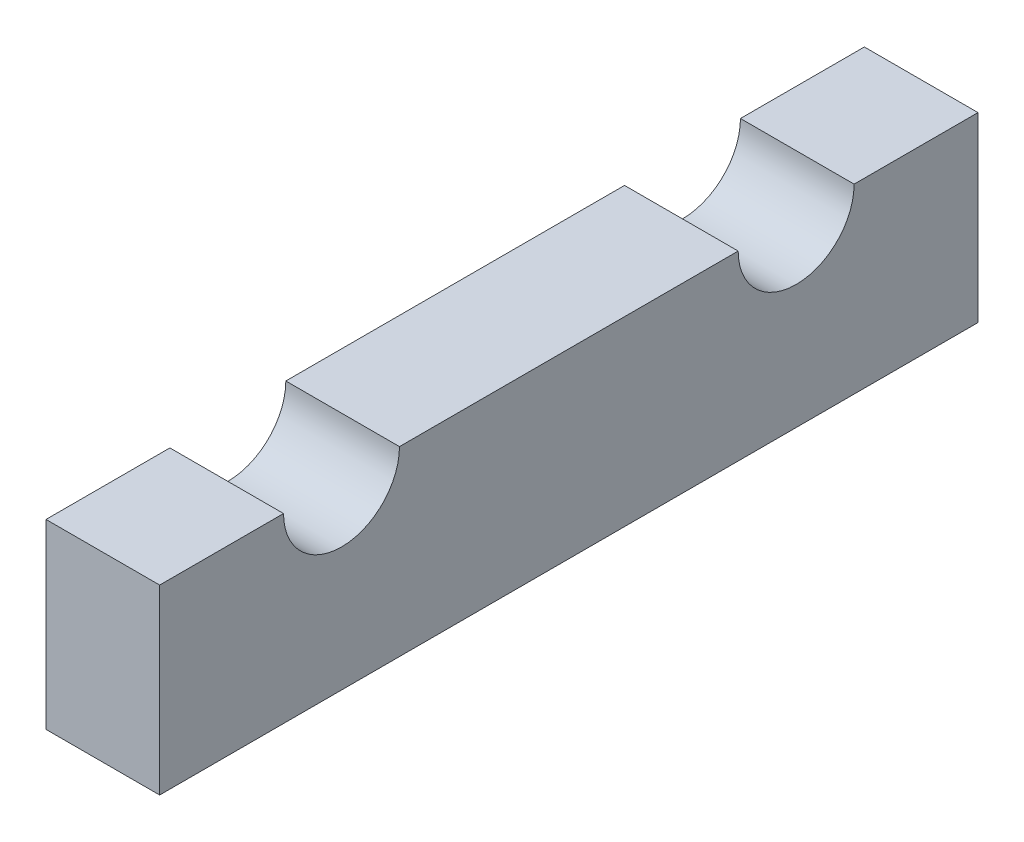
ISO-10303-21;
HEADER;
FILE_DESCRIPTION(('STEP AP214'),'2;1');
FILE_NAME('part.step','',(''),(''),'','','');
FILE_SCHEMA(('AUTOMOTIVE_DESIGN { 1 0 10303 214 1 1 1 1 }'));
ENDSEC;
DATA;
#1=APPLICATION_CONTEXT('core data for automotive mechanical design processes');
#2=APPLICATION_PROTOCOL_DEFINITION('international standard','automotive_design',2000,#1);
#3=PRODUCT_CONTEXT('',#1,'mechanical');
#4=PRODUCT('Part','Part','',(#3));
#5=PRODUCT_RELATED_PRODUCT_CATEGORY('part','',(#4));
#6=PRODUCT_DEFINITION_FORMATION('','',#4);
#7=PRODUCT_DEFINITION_CONTEXT('part definition',#1,'design');
#8=PRODUCT_DEFINITION('design','',#6,#7);
#9=PRODUCT_DEFINITION_SHAPE('','',#8);
#10=(LENGTH_UNIT() NAMED_UNIT(*) SI_UNIT(.MILLI.,.METRE.));
#11=(NAMED_UNIT(*) PLANE_ANGLE_UNIT() SI_UNIT($,.RADIAN.));
#12=(NAMED_UNIT(*) SI_UNIT($,.STERADIAN.) SOLID_ANGLE_UNIT());
#13=UNCERTAINTY_MEASURE_WITH_UNIT(LENGTH_MEASURE(1.E-05),#10,'distance_accuracy_value','');
#14=(GEOMETRIC_REPRESENTATION_CONTEXT(3) GLOBAL_UNCERTAINTY_ASSIGNED_CONTEXT((#13)) GLOBAL_UNIT_ASSIGNED_CONTEXT((#10,
#11,#12)) REPRESENTATION_CONTEXT('',''));
#15=CARTESIAN_POINT('',(0.,0.,0.));
#16=DIRECTION('',(0.,0.,1.));
#17=DIRECTION('',(1.,0.,0.));
#18=AXIS2_PLACEMENT_3D('',#15,#16,#17);
#19=CARTESIAN_POINT('',(5.,0.,18.));
#20=DIRECTION('',(0.,0.,-1.));
#21=DIRECTION('',(-1.,0.,0.));
#22=AXIS2_PLACEMENT_3D('',#19,#20,#21);
#23=PLANE('',#22);
#24=DIRECTION('',(0.,-1.,0.));
#25=VECTOR('',#24,1.);
#26=CARTESIAN_POINT('',(0.,0.,18.));
#27=LINE('',#26,#25);
#28=CARTESIAN_POINT('',(0.,8.,18.));
#29=VERTEX_POINT('',#28);
#30=CARTESIAN_POINT('',(0.,0.,18.));
#31=VERTEX_POINT('',#30);
#32=EDGE_CURVE('E131',#29,#31,#27,.T.);
#33=ORIENTED_EDGE('',*,*,#32,.T.);
#34=DIRECTION('',(-1.,0.,0.));
#35=VECTOR('',#34,1.);
#36=CARTESIAN_POINT('',(5.,0.,18.));
#37=LINE('',#36,#35);
#38=CARTESIAN_POINT('',(5.,0.,18.));
#39=VERTEX_POINT('',#38);
#40=EDGE_CURVE('E11',#39,#31,#37,.T.);
#41=ORIENTED_EDGE('',*,*,#40,.F.);
#42=DIRECTION('',(0.,-1.,0.));
#43=VECTOR('',#42,1.);
#44=CARTESIAN_POINT('',(5.,0.,18.));
#45=LINE('',#44,#43);
#46=CARTESIAN_POINT('',(5.,8.,18.));
#47=VERTEX_POINT('',#46);
#48=EDGE_CURVE('E145',#47,#39,#45,.T.);
#49=ORIENTED_EDGE('',*,*,#48,.F.);
#50=DIRECTION('',(-1.,0.,0.));
#51=VECTOR('',#50,1.);
#52=CARTESIAN_POINT('',(5.,8.,18.));
#53=LINE('',#52,#51);
#54=EDGE_CURVE('E127',#47,#29,#53,.T.);
#55=ORIENTED_EDGE('',*,*,#54,.T.);
#56=EDGE_LOOP('',(#33,#41,#49,#55));
#57=FACE_BOUND('',#56,.T.);
#58=ADVANCED_FACE('F35',(#57),#23,.F.);
#59=CARTESIAN_POINT('',(5.,0.,18.));
#60=DIRECTION('',(0.,1.,0.));
#61=DIRECTION('',(0.,0.,1.));
#62=AXIS2_PLACEMENT_3D('',#59,#60,#61);
#63=PLANE('',#62);
#64=DIRECTION('',(0.,0.,-1.));
#65=VECTOR('',#64,1.);
#66=CARTESIAN_POINT('',(0.,0.,18.));
#67=LINE('',#66,#65);
#68=CARTESIAN_POINT('',(0.,0.,-18.));
#69=VERTEX_POINT('',#68);
#70=EDGE_CURVE('E134',#31,#69,#67,.T.);
#71=ORIENTED_EDGE('',*,*,#70,.T.);
#72=DIRECTION('',(-1.,0.,0.));
#73=VECTOR('',#72,1.);
#74=CARTESIAN_POINT('',(5.,0.,-18.));
#75=LINE('',#74,#73);
#76=CARTESIAN_POINT('',(5.,0.,-18.));
#77=VERTEX_POINT('',#76);
#78=EDGE_CURVE('E43',#77,#69,#75,.T.);
#79=ORIENTED_EDGE('',*,*,#78,.F.);
#80=DIRECTION('',(0.,0.,-1.));
#81=VECTOR('',#80,1.);
#82=CARTESIAN_POINT('',(5.,0.,18.));
#83=LINE('',#82,#81);
#84=EDGE_CURVE('E94',#39,#77,#83,.T.);
#85=ORIENTED_EDGE('',*,*,#84,.F.);
#86=ORIENTED_EDGE('',*,*,#40,.T.);
#87=EDGE_LOOP('',(#71,#79,#85,#86));
#88=FACE_BOUND('',#87,.T.);
#89=ADVANCED_FACE('F180',(#88),#63,.F.);
#90=CARTESIAN_POINT('',(5.,0.,-18.));
#91=DIRECTION('',(0.,0.,1.));
#92=DIRECTION('',(1.,0.,0.));
#93=AXIS2_PLACEMENT_3D('',#90,#91,#92);
#94=PLANE('',#93);
#95=DIRECTION('',(0.,1.,0.));
#96=VECTOR('',#95,1.);
#97=CARTESIAN_POINT('',(0.,0.,-18.));
#98=LINE('',#97,#96);
#99=CARTESIAN_POINT('',(0.,8.,-18.));
#100=VERTEX_POINT('',#99);
#101=EDGE_CURVE('E136',#69,#100,#98,.T.);
#102=ORIENTED_EDGE('',*,*,#101,.T.);
#103=DIRECTION('',(-1.,0.,0.));
#104=VECTOR('',#103,1.);
#105=CARTESIAN_POINT('',(5.,8.,-18.));
#106=LINE('',#105,#104);
#107=CARTESIAN_POINT('',(5.,8.,-18.));
#108=VERTEX_POINT('',#107);
#109=EDGE_CURVE('E152',#108,#100,#106,.T.);
#110=ORIENTED_EDGE('',*,*,#109,.F.);
#111=DIRECTION('',(0.,1.,0.));
#112=VECTOR('',#111,1.);
#113=CARTESIAN_POINT('',(5.,0.,-18.));
#114=LINE('',#113,#112);
#115=EDGE_CURVE('E160',#77,#108,#114,.T.);
#116=ORIENTED_EDGE('',*,*,#115,.F.);
#117=ORIENTED_EDGE('',*,*,#78,.T.);
#118=EDGE_LOOP('',(#102,#110,#116,#117));
#119=FACE_BOUND('',#118,.T.);
#120=ADVANCED_FACE('F158',(#119),#94,.F.);
#121=CARTESIAN_POINT('',(5.,8.,-12.55));
#122=DIRECTION('',(0.,-1.,0.));
#123=DIRECTION('',(0.,0.,-1.));
#124=AXIS2_PLACEMENT_3D('',#121,#122,#123);
#125=PLANE('',#124);
#126=DIRECTION('',(0.,0.,1.));
#127=VECTOR('',#126,1.);
#128=CARTESIAN_POINT('',(0.,8.,-12.55));
#129=LINE('',#128,#127);
#130=CARTESIAN_POINT('',(0.,8.,-12.55));
#131=VERTEX_POINT('',#130);
#132=EDGE_CURVE('E138',#100,#131,#129,.T.);
#133=ORIENTED_EDGE('',*,*,#132,.T.);
#134=DIRECTION('',(-1.,0.,0.));
#135=VECTOR('',#134,1.);
#136=CARTESIAN_POINT('',(5.,8.,-12.55));
#137=LINE('',#136,#135);
#138=CARTESIAN_POINT('',(5.,8.,-12.55));
#139=VERTEX_POINT('',#138);
#140=EDGE_CURVE('E149',#139,#131,#137,.T.);
#141=ORIENTED_EDGE('',*,*,#140,.F.);
#142=DIRECTION('',(0.,0.,1.));
#143=VECTOR('',#142,1.);
#144=CARTESIAN_POINT('',(5.,8.,-12.55));
#145=LINE('',#144,#143);
#146=EDGE_CURVE('E172',#108,#139,#145,.T.);
#147=ORIENTED_EDGE('',*,*,#146,.F.);
#148=ORIENTED_EDGE('',*,*,#109,.T.);
#149=EDGE_LOOP('',(#133,#141,#147,#148));
#150=FACE_BOUND('',#149,.T.);
#151=ADVANCED_FACE('F168',(#150),#125,.F.);
#152=CARTESIAN_POINT('',(5.,8.,-10.));
#153=DIRECTION('',(-1.,0.,0.));
#154=DIRECTION('',(0.,0.,1.));
#155=AXIS2_PLACEMENT_3D('',#152,#153,#154);
#156=CYLINDRICAL_SURFACE('',#155,2.55);
#157=CARTESIAN_POINT('',(0.,8.,-10.));
#158=DIRECTION('',(-1.,0.,0.));
#159=DIRECTION('',(0.,0.,-1.));
#160=AXIS2_PLACEMENT_3D('',#157,#158,#159);
#161=CIRCLE('',#160,2.55);
#162=CARTESIAN_POINT('',(0.,8.,-7.45));
#163=VERTEX_POINT('',#162);
#164=EDGE_CURVE('E140',#131,#163,#161,.T.);
#165=ORIENTED_EDGE('',*,*,#164,.T.);
#166=DIRECTION('',(-1.,0.,0.));
#167=VECTOR('',#166,1.);
#168=CARTESIAN_POINT('',(5.,8.,-7.45));
#169=LINE('',#168,#167);
#170=CARTESIAN_POINT('',(5.,8.,-7.45));
#171=VERTEX_POINT('',#170);
#172=EDGE_CURVE('E122',#171,#163,#169,.T.);
#173=ORIENTED_EDGE('',*,*,#172,.F.);
#174=CARTESIAN_POINT('',(5.,8.,-10.));
#175=DIRECTION('',(-1.,0.,0.));
#176=DIRECTION('',(0.,0.,-1.));
#177=AXIS2_PLACEMENT_3D('',#174,#175,#176);
#178=CIRCLE('',#177,2.55);
#179=EDGE_CURVE('E113',#139,#171,#178,.T.);
#180=ORIENTED_EDGE('',*,*,#179,.F.);
#181=ORIENTED_EDGE('',*,*,#140,.T.);
#182=EDGE_LOOP('',(#165,#173,#180,#181));
#183=FACE_BOUND('',#182,.T.);
#184=ADVANCED_FACE('F171',(#183),#156,.F.);
#185=CARTESIAN_POINT('',(5.,8.,7.45));
#186=DIRECTION('',(0.,-1.,0.));
#187=DIRECTION('',(0.,0.,-1.));
#188=AXIS2_PLACEMENT_3D('',#185,#186,#187);
#189=PLANE('',#188);
#190=DIRECTION('',(0.,0.,1.));
#191=VECTOR('',#190,1.);
#192=CARTESIAN_POINT('',(0.,8.,7.45));
#193=LINE('',#192,#191);
#194=CARTESIAN_POINT('',(0.,8.,7.45));
#195=VERTEX_POINT('',#194);
#196=EDGE_CURVE('E121',#163,#195,#193,.T.);
#197=ORIENTED_EDGE('',*,*,#196,.T.);
#198=DIRECTION('',(-1.,0.,0.));
#199=VECTOR('',#198,1.);
#200=CARTESIAN_POINT('',(5.,8.,7.45));
#201=LINE('',#200,#199);
#202=CARTESIAN_POINT('',(5.,8.,7.45));
#203=VERTEX_POINT('',#202);
#204=EDGE_CURVE('E118',#203,#195,#201,.T.);
#205=ORIENTED_EDGE('',*,*,#204,.F.);
#206=DIRECTION('',(0.,0.,1.));
#207=VECTOR('',#206,1.);
#208=CARTESIAN_POINT('',(5.,8.,7.45));
#209=LINE('',#208,#207);
#210=EDGE_CURVE('E107',#171,#203,#209,.T.);
#211=ORIENTED_EDGE('',*,*,#210,.F.);
#212=ORIENTED_EDGE('',*,*,#172,.T.);
#213=EDGE_LOOP('',(#197,#205,#211,#212));
#214=FACE_BOUND('',#213,.T.);
#215=ADVANCED_FACE('F119',(#214),#189,.F.);
#216=CARTESIAN_POINT('',(5.,8.,10.));
#217=DIRECTION('',(-1.,0.,0.));
#218=DIRECTION('',(0.,0.,1.));
#219=AXIS2_PLACEMENT_3D('',#216,#217,#218);
#220=CYLINDRICAL_SURFACE('',#219,2.55);
#221=CARTESIAN_POINT('',(0.,8.,10.));
#222=DIRECTION('',(-1.,0.,0.));
#223=DIRECTION('',(0.,0.,-1.));
#224=AXIS2_PLACEMENT_3D('',#221,#222,#223);
#225=CIRCLE('',#224,2.55);
#226=CARTESIAN_POINT('',(0.,8.,12.55));
#227=VERTEX_POINT('',#226);
#228=EDGE_CURVE('E80',#195,#227,#225,.T.);
#229=ORIENTED_EDGE('',*,*,#228,.T.);
#230=DIRECTION('',(-1.,0.,0.));
#231=VECTOR('',#230,1.);
#232=CARTESIAN_POINT('',(5.,8.,12.55));
#233=LINE('',#232,#231);
#234=CARTESIAN_POINT('',(5.,8.,12.55));
#235=VERTEX_POINT('',#234);
#236=EDGE_CURVE('E123',#235,#227,#233,.T.);
#237=ORIENTED_EDGE('',*,*,#236,.F.);
#238=CARTESIAN_POINT('',(5.,8.,10.));
#239=DIRECTION('',(-1.,0.,0.));
#240=DIRECTION('',(0.,0.,-1.));
#241=AXIS2_PLACEMENT_3D('',#238,#239,#240);
#242=CIRCLE('',#241,2.55);
#243=EDGE_CURVE('E111',#203,#235,#242,.T.);
#244=ORIENTED_EDGE('',*,*,#243,.F.);
#245=ORIENTED_EDGE('',*,*,#204,.T.);
#246=EDGE_LOOP('',(#229,#237,#244,#245));
#247=FACE_BOUND('',#246,.T.);
#248=ADVANCED_FACE('F125',(#247),#220,.F.);
#249=CARTESIAN_POINT('',(5.,8.,18.));
#250=DIRECTION('',(0.,-1.,0.));
#251=DIRECTION('',(0.,0.,-1.));
#252=AXIS2_PLACEMENT_3D('',#249,#250,#251);
#253=PLANE('',#252);
#254=DIRECTION('',(0.,0.,1.));
#255=VECTOR('',#254,1.);
#256=CARTESIAN_POINT('',(0.,8.,18.));
#257=LINE('',#256,#255);
#258=EDGE_CURVE('E86',#227,#29,#257,.T.);
#259=ORIENTED_EDGE('',*,*,#258,.T.);
#260=ORIENTED_EDGE('',*,*,#54,.F.);
#261=DIRECTION('',(0.,0.,1.));
#262=VECTOR('',#261,1.);
#263=CARTESIAN_POINT('',(5.,8.,18.));
#264=LINE('',#263,#262);
#265=EDGE_CURVE('E51',#235,#47,#264,.T.);
#266=ORIENTED_EDGE('',*,*,#265,.F.);
#267=ORIENTED_EDGE('',*,*,#236,.T.);
#268=EDGE_LOOP('',(#259,#260,#266,#267));
#269=FACE_BOUND('',#268,.T.);
#270=ADVANCED_FACE('F196',(#269),#253,.F.);
#271=CARTESIAN_POINT('',(5.,8.,10.));
#272=DIRECTION('',(1.,0.,0.));
#273=DIRECTION('',(0.,0.,-1.));
#274=AXIS2_PLACEMENT_3D('',#271,#272,#273);
#275=PLANE('',#274);
#276=ORIENTED_EDGE('',*,*,#48,.T.);
#277=ORIENTED_EDGE('',*,*,#84,.T.);
#278=ORIENTED_EDGE('',*,*,#115,.T.);
#279=ORIENTED_EDGE('',*,*,#146,.T.);
#280=ORIENTED_EDGE('',*,*,#179,.T.);
#281=ORIENTED_EDGE('',*,*,#210,.T.);
#282=ORIENTED_EDGE('',*,*,#243,.T.);
#283=ORIENTED_EDGE('',*,*,#265,.T.);
#284=EDGE_LOOP('',(#276,#277,#278,#279,#280,#281,#282,#283));
#285=FACE_BOUND('',#284,.T.);
#286=ADVANCED_FACE('F109',(#285),#275,.T.);
#287=CARTESIAN_POINT('',(0.,8.,10.));
#288=DIRECTION('',(1.,0.,0.));
#289=DIRECTION('',(0.,0.,-1.));
#290=AXIS2_PLACEMENT_3D('',#287,#288,#289);
#291=PLANE('',#290);
#292=ORIENTED_EDGE('',*,*,#32,.F.);
#293=ORIENTED_EDGE('',*,*,#258,.F.);
#294=ORIENTED_EDGE('',*,*,#228,.F.);
#295=ORIENTED_EDGE('',*,*,#196,.F.);
#296=ORIENTED_EDGE('',*,*,#164,.F.);
#297=ORIENTED_EDGE('',*,*,#132,.F.);
#298=ORIENTED_EDGE('',*,*,#101,.F.);
#299=ORIENTED_EDGE('',*,*,#70,.F.);
#300=EDGE_LOOP('',(#292,#293,#294,#295,#296,#297,#298,#299));
#301=FACE_BOUND('',#300,.T.);
#302=ADVANCED_FACE('F164',(#301),#291,.F.);
#303=CLOSED_SHELL('',(#58,#89,#120,#151,#184,#215,#248,#270,#286,#302));
#304=MANIFOLD_SOLID_BREP('B2',#303);
#305=ADVANCED_BREP_SHAPE_REPRESENTATION('',(#18,#304),#14);
#306=SHAPE_DEFINITION_REPRESENTATION(#9,#305);
ENDSEC;
END-ISO-10303-21;
